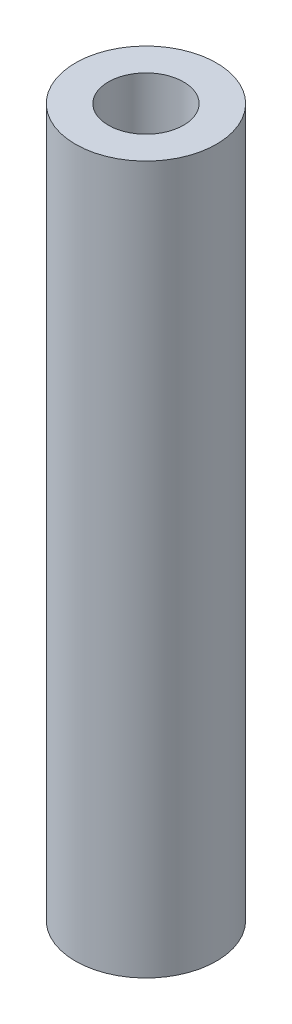
ISO-10303-21;
HEADER;
FILE_DESCRIPTION(('STEP AP214'),'2;1');
FILE_NAME('part.step','',(''),(''),'','','');
FILE_SCHEMA(('AUTOMOTIVE_DESIGN { 1 0 10303 214 1 1 1 1 }'));
ENDSEC;
DATA;
#1=APPLICATION_CONTEXT('core data for automotive mechanical design processes');
#2=APPLICATION_PROTOCOL_DEFINITION('international standard','automotive_design',2000,#1);
#3=PRODUCT_CONTEXT('',#1,'mechanical');
#4=PRODUCT('Part','Part','',(#3));
#5=PRODUCT_RELATED_PRODUCT_CATEGORY('part','',(#4));
#6=PRODUCT_DEFINITION_FORMATION('','',#4);
#7=PRODUCT_DEFINITION_CONTEXT('part definition',#1,'design');
#8=PRODUCT_DEFINITION('design','',#6,#7);
#9=PRODUCT_DEFINITION_SHAPE('','',#8);
#10=(LENGTH_UNIT() NAMED_UNIT(*) SI_UNIT(.MILLI.,.METRE.));
#11=(NAMED_UNIT(*) PLANE_ANGLE_UNIT() SI_UNIT($,.RADIAN.));
#12=(NAMED_UNIT(*) SI_UNIT($,.STERADIAN.) SOLID_ANGLE_UNIT());
#13=UNCERTAINTY_MEASURE_WITH_UNIT(LENGTH_MEASURE(1.E-05),#10,'distance_accuracy_value','');
#14=(GEOMETRIC_REPRESENTATION_CONTEXT(3) GLOBAL_UNCERTAINTY_ASSIGNED_CONTEXT((#13)) GLOBAL_UNIT_ASSIGNED_CONTEXT((#10,
#11,#12)) REPRESENTATION_CONTEXT('',''));
#15=CARTESIAN_POINT('',(0.,0.,0.));
#16=DIRECTION('',(0.,0.,1.));
#17=DIRECTION('',(1.,0.,0.));
#18=AXIS2_PLACEMENT_3D('',#15,#16,#17);
#19=CARTESIAN_POINT('',(0.,-75.26,0.));
#20=DIRECTION('',(0.,1.,0.));
#21=DIRECTION('',(0.,0.,1.));
#22=AXIS2_PLACEMENT_3D('',#19,#20,#21);
#23=CYLINDRICAL_SURFACE('',#22,7.5);
#24=CARTESIAN_POINT('',(0.,-75.26,0.));
#25=DIRECTION('',(0.,1.,0.));
#26=DIRECTION('',(0.,0.,1.));
#27=AXIS2_PLACEMENT_3D('',#24,#25,#26);
#28=CIRCLE('',#27,7.5);
#29=CARTESIAN_POINT('',(0.,-75.26,7.5));
#30=VERTEX_POINT('',#29);
#31=EDGE_CURVE('E10',#30,#30,#28,.T.);
#32=ORIENTED_EDGE('',*,*,#31,.T.);
#33=EDGE_LOOP('',(#32));
#34=FACE_BOUND('',#33,.T.);
#35=CARTESIAN_POINT('',(0.,0.,0.));
#36=DIRECTION('',(0.,1.,0.));
#37=DIRECTION('',(0.,0.,1.));
#38=AXIS2_PLACEMENT_3D('',#35,#36,#37);
#39=CIRCLE('',#38,7.5);
#40=CARTESIAN_POINT('',(0.,0.,7.5));
#41=VERTEX_POINT('',#40);
#42=EDGE_CURVE('E40',#41,#41,#39,.T.);
#43=ORIENTED_EDGE('',*,*,#42,.F.);
#44=EDGE_LOOP('',(#43));
#45=FACE_BOUND('',#44,.T.);
#46=ADVANCED_FACE('F37',(#34,#45),#23,.T.);
#47=CARTESIAN_POINT('',(0.,-75.26,0.));
#48=DIRECTION('',(0.,1.,0.));
#49=DIRECTION('',(0.,0.,1.));
#50=AXIS2_PLACEMENT_3D('',#47,#48,#49);
#51=PLANE('',#50);
#52=ORIENTED_EDGE('',*,*,#31,.F.);
#53=EDGE_LOOP('',(#52));
#54=FACE_BOUND('',#53,.T.);
#55=ADVANCED_FACE('F70',(#54),#51,.F.);
#56=CARTESIAN_POINT('',(0.,0.,0.));
#57=DIRECTION('',(0.,1.,0.));
#58=DIRECTION('',(0.,0.,1.));
#59=AXIS2_PLACEMENT_3D('',#56,#57,#58);
#60=PLANE('',#59);
#61=CARTESIAN_POINT('',(0.,0.,0.));
#62=DIRECTION('',(0.,1.,0.));
#63=DIRECTION('',(0.,0.,1.));
#64=AXIS2_PLACEMENT_3D('',#61,#62,#63);
#65=CIRCLE('',#64,4.);
#66=CARTESIAN_POINT('',(0.,0.,4.));
#67=VERTEX_POINT('',#66);
#68=EDGE_CURVE('E51',#67,#67,#65,.T.);
#69=ORIENTED_EDGE('',*,*,#68,.F.);
#70=EDGE_LOOP('',(#69));
#71=FACE_BOUND('',#70,.T.);
#72=ORIENTED_EDGE('',*,*,#42,.T.);
#73=EDGE_LOOP('',(#72));
#74=FACE_BOUND('',#73,.T.);
#75=ADVANCED_FACE('F64',(#71,#74),#60,.T.);
#76=CARTESIAN_POINT('',(0.,-21.36,0.));
#77=DIRECTION('',(0.,1.,0.));
#78=DIRECTION('',(0.,0.,1.));
#79=AXIS2_PLACEMENT_3D('',#76,#77,#78);
#80=CYLINDRICAL_SURFACE('',#79,4.);
#81=CARTESIAN_POINT('',(0.,-21.36,0.));
#82=DIRECTION('',(0.,1.,0.));
#83=DIRECTION('',(0.,0.,1.));
#84=AXIS2_PLACEMENT_3D('',#81,#82,#83);
#85=CIRCLE('',#84,4.);
#86=CARTESIAN_POINT('',(0.,-21.36,4.));
#87=VERTEX_POINT('',#86);
#88=EDGE_CURVE('E49',#87,#87,#85,.T.);
#89=CARTESIAN_POINT('',(0.,-21.36,4.));
#90=CARTESIAN_POINT('',(0.,-21.1375,4.));
#91=CARTESIAN_POINT('',(0.,-20.915,4.));
#92=CARTESIAN_POINT('',(0.,-20.47,4.));
#93=CARTESIAN_POINT('',(0.,-20.2475,4.));
#94=CARTESIAN_POINT('',(0.,-19.8025,4.));
#95=CARTESIAN_POINT('',(0.,-19.58,4.));
#96=CARTESIAN_POINT('',(0.,-19.135,4.));
#97=CARTESIAN_POINT('',(0.,-18.9125,4.));
#98=CARTESIAN_POINT('',(0.,-18.4675,4.));
#99=CARTESIAN_POINT('',(0.,-18.245,4.));
#100=CARTESIAN_POINT('',(0.,-17.8,4.));
#101=CARTESIAN_POINT('',(0.,-17.5775,4.));
#102=CARTESIAN_POINT('',(0.,-17.1325,4.));
#103=CARTESIAN_POINT('',(0.,-16.91,4.));
#104=CARTESIAN_POINT('',(0.,-16.465,4.));
#105=CARTESIAN_POINT('',(0.,-16.2425,4.));
#106=CARTESIAN_POINT('',(0.,-15.7975,4.));
#107=CARTESIAN_POINT('',(0.,-15.575,4.));
#108=CARTESIAN_POINT('',(0.,-15.13,4.));
#109=CARTESIAN_POINT('',(0.,-14.9075,4.));
#110=CARTESIAN_POINT('',(0.,-14.4625,4.));
#111=CARTESIAN_POINT('',(0.,-14.24,4.));
#112=CARTESIAN_POINT('',(0.,-13.795,4.));
#113=CARTESIAN_POINT('',(0.,-13.5725,4.));
#114=CARTESIAN_POINT('',(0.,-13.1275,4.));
#115=CARTESIAN_POINT('',(0.,-12.905,4.));
#116=CARTESIAN_POINT('',(0.,-12.46,4.));
#117=CARTESIAN_POINT('',(0.,-12.2375,4.));
#118=CARTESIAN_POINT('',(0.,-11.7925,4.));
#119=CARTESIAN_POINT('',(0.,-11.57,4.));
#120=CARTESIAN_POINT('',(0.,-11.125,4.));
#121=CARTESIAN_POINT('',(0.,-10.9025,4.));
#122=CARTESIAN_POINT('',(0.,-10.4575,4.));
#123=CARTESIAN_POINT('',(0.,-10.235,4.));
#124=CARTESIAN_POINT('',(0.,-9.79,4.));
#125=CARTESIAN_POINT('',(0.,-9.5675,4.));
#126=CARTESIAN_POINT('',(0.,-9.1225,4.));
#127=CARTESIAN_POINT('',(0.,-8.9,4.));
#128=CARTESIAN_POINT('',(0.,-8.455,4.));
#129=CARTESIAN_POINT('',(0.,-8.2325,4.));
#130=CARTESIAN_POINT('',(0.,-7.7875,4.));
#131=CARTESIAN_POINT('',(0.,-7.565,4.));
#132=CARTESIAN_POINT('',(0.,-7.12,4.));
#133=CARTESIAN_POINT('',(0.,-6.8975,4.));
#134=CARTESIAN_POINT('',(0.,-6.4525,4.));
#135=CARTESIAN_POINT('',(0.,-6.23,4.));
#136=CARTESIAN_POINT('',(0.,-5.785,4.));
#137=CARTESIAN_POINT('',(0.,-5.5625,4.));
#138=CARTESIAN_POINT('',(0.,-5.1175,4.));
#139=CARTESIAN_POINT('',(0.,-4.895,4.));
#140=CARTESIAN_POINT('',(0.,-4.45,4.));
#141=CARTESIAN_POINT('',(0.,-4.2275,4.));
#142=CARTESIAN_POINT('',(0.,-3.7825,4.));
#143=CARTESIAN_POINT('',(0.,-3.56,4.));
#144=CARTESIAN_POINT('',(0.,-3.115,4.));
#145=CARTESIAN_POINT('',(0.,-2.8925,4.));
#146=CARTESIAN_POINT('',(0.,-2.4475,4.));
#147=CARTESIAN_POINT('',(0.,-2.225,4.));
#148=CARTESIAN_POINT('',(0.,-1.78,4.));
#149=CARTESIAN_POINT('',(0.,-1.5575,4.));
#150=CARTESIAN_POINT('',(0.,-1.1125,4.));
#151=CARTESIAN_POINT('',(0.,-0.890000000000001,4.));
#152=CARTESIAN_POINT('',(0.,-0.445000000000001,4.));
#153=CARTESIAN_POINT('',(0.,-0.2225,4.));
#154=CARTESIAN_POINT('',(0.,0.,4.));
#155=B_SPLINE_CURVE_WITH_KNOTS('',3,(#89,#90,#91,#92,#93,#94,#95,#96,#97,#98,#99,#100,#101,#102,
#103,#104,#105,#106,#107,#108,#109,#110,#111,#112,#113,#114,#115,#116,#117,#118,#119,#120,#121,
#122,#123,#124,#125,#126,#127,#128,#129,#130,#131,#132,#133,#134,#135,#136,#137,#138,#139,#140,
#141,#142,#143,#144,#145,#146,#147,#148,#149,#150,#151,#152,#153,#154),.UNSPECIFIED.,.F.,.F.,(4,
2,2,2,2,2,2,2,2,2,2,2,2,2,2,2,2,2,2,2,2,2,2,2,2,2,2,2,2,2,2,2,4),(0.,0.667499999999998,1.335,
2.0025,2.67,3.3375,4.005,4.6725,5.34,6.0075,6.675,7.3425,8.01,8.6775,9.345,10.0125,10.68,
11.3475,12.015,12.6825,13.35,14.0175,14.685,15.3525,16.02,16.6875,17.355,18.0225,18.69,19.3575,
20.025,20.6925,21.36),.UNSPECIFIED.);
#156=EDGE_CURVE('BSEAM61',#87,#67,#155,.T.);
#157=ORIENTED_EDGE('',*,*,#88,.F.);
#158=ORIENTED_EDGE('',*,*,#68,.T.);
#159=ORIENTED_EDGE('',*,*,#156,.T.);
#160=ORIENTED_EDGE('',*,*,#156,.F.);
#161=EDGE_LOOP('',(#157,#159,#158,#160));
#162=FACE_BOUND('',#161,.T.);
#163=ADVANCED_FACE('F61',(#162),#80,.F.);
#164=CARTESIAN_POINT('',(0.,-21.36,0.));
#165=DIRECTION('',(0.,1.,0.));
#166=DIRECTION('',(0.,0.,1.));
#167=AXIS2_PLACEMENT_3D('',#164,#165,#166);
#168=PLANE('',#167);
#169=ORIENTED_EDGE('',*,*,#88,.T.);
#170=EDGE_LOOP('',(#169));
#171=FACE_BOUND('',#170,.T.);
#172=ADVANCED_FACE('F59',(#171),#168,.T.);
#173=CLOSED_SHELL('',(#46,#55,#75,#163,#172));
#174=MANIFOLD_SOLID_BREP('B2',#173);
#175=ADVANCED_BREP_SHAPE_REPRESENTATION('',(#18,#174),#14);
#176=SHAPE_DEFINITION_REPRESENTATION(#9,#175);
ENDSEC;
END-ISO-10303-21;
